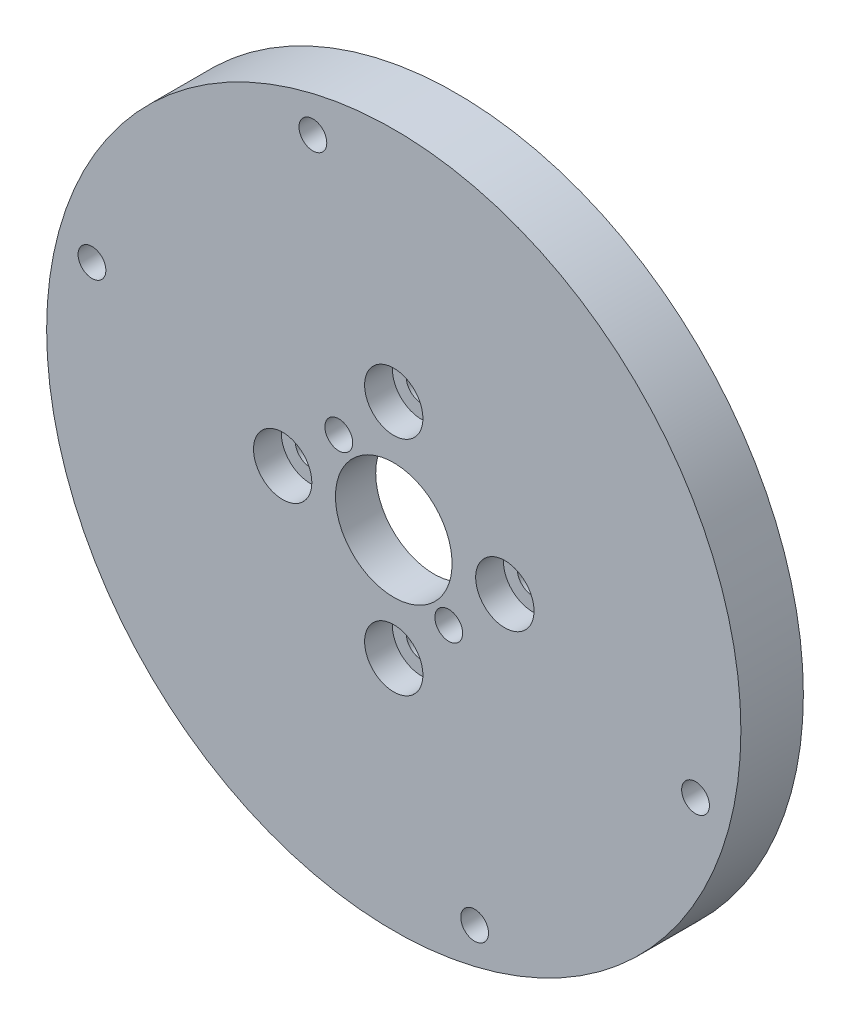
ISO-10303-21;
HEADER;
FILE_DESCRIPTION(('STEP AP214'),'2;1');
FILE_NAME('part.step','',(''),(''),'','','');
FILE_SCHEMA(('AUTOMOTIVE_DESIGN { 1 0 10303 214 1 1 1 1 }'));
ENDSEC;
DATA;
#1=APPLICATION_CONTEXT('core data for automotive mechanical design processes');
#2=APPLICATION_PROTOCOL_DEFINITION('international standard','automotive_design',2000,#1);
#3=PRODUCT_CONTEXT('',#1,'mechanical');
#4=PRODUCT('Part','Part','',(#3));
#5=PRODUCT_RELATED_PRODUCT_CATEGORY('part','',(#4));
#6=PRODUCT_DEFINITION_FORMATION('','',#4);
#7=PRODUCT_DEFINITION_CONTEXT('part definition',#1,'design');
#8=PRODUCT_DEFINITION('design','',#6,#7);
#9=PRODUCT_DEFINITION_SHAPE('','',#8);
#10=(LENGTH_UNIT() NAMED_UNIT(*) SI_UNIT(.MILLI.,.METRE.));
#11=(NAMED_UNIT(*) PLANE_ANGLE_UNIT() SI_UNIT($,.RADIAN.));
#12=(NAMED_UNIT(*) SI_UNIT($,.STERADIAN.) SOLID_ANGLE_UNIT());
#13=UNCERTAINTY_MEASURE_WITH_UNIT(LENGTH_MEASURE(1.E-05),#10,'distance_accuracy_value','');
#14=(GEOMETRIC_REPRESENTATION_CONTEXT(3) GLOBAL_UNCERTAINTY_ASSIGNED_CONTEXT((#13)) GLOBAL_UNIT_ASSIGNED_CONTEXT((#10,
#11,#12)) REPRESENTATION_CONTEXT('',''));
#15=CARTESIAN_POINT('',(0.,0.,0.));
#16=DIRECTION('',(0.,0.,1.));
#17=DIRECTION('',(1.,0.,0.));
#18=AXIS2_PLACEMENT_3D('',#15,#16,#17);
#19=CARTESIAN_POINT('',(8.00000000000027,2.75810479722345E-13,4.5));
#20=DIRECTION('',(0.,0.,-1.));
#21=DIRECTION('',(-1.,0.,0.));
#22=AXIS2_PLACEMENT_3D('',#19,#20,#21);
#23=CYLINDRICAL_SURFACE('',#22,1.10000000000009);
#24=CARTESIAN_POINT('',(8.00000000000027,2.75810479722345E-13,2.5));
#25=DIRECTION('',(0.,0.,1.));
#26=DIRECTION('',(1.,0.,0.));
#27=AXIS2_PLACEMENT_3D('',#24,#25,#26);
#28=CIRCLE('',#27,1.10000000000009);
#29=CARTESIAN_POINT('',(9.10000000000036,2.75810479722345E-13,2.5));
#30=VERTEX_POINT('',#29);
#31=EDGE_CURVE('E37',#30,#30,#28,.T.);
#32=ORIENTED_EDGE('',*,*,#31,.T.);
#33=EDGE_LOOP('',(#32));
#34=FACE_BOUND('',#33,.T.);
#35=CARTESIAN_POINT('',(8.00000000000027,2.75810479722345E-13,1.6));
#36=DIRECTION('',(0.,0.,-1.));
#37=DIRECTION('',(-1.,0.,0.));
#38=AXIS2_PLACEMENT_3D('',#35,#36,#37);
#39=CIRCLE('',#38,1.10000000000009);
#40=CARTESIAN_POINT('',(6.90000000000019,2.75810479722345E-13,1.6));
#41=VERTEX_POINT('',#40);
#42=EDGE_CURVE('E231',#41,#41,#39,.T.);
#43=ORIENTED_EDGE('',*,*,#42,.T.);
#44=EDGE_LOOP('',(#43));
#45=FACE_BOUND('',#44,.T.);
#46=ADVANCED_FACE('F33',(#34,#45),#23,.F.);
#47=CARTESIAN_POINT('',(5.5162095944469E-13,-8.,4.5));
#48=DIRECTION('',(0.,0.,-1.));
#49=DIRECTION('',(-1.,0.,0.));
#50=AXIS2_PLACEMENT_3D('',#47,#48,#49);
#51=CYLINDRICAL_SURFACE('',#50,1.10000000000014);
#52=CARTESIAN_POINT('',(5.5162095944469E-13,-8.,2.5));
#53=DIRECTION('',(0.,0.,1.));
#54=DIRECTION('',(1.,0.,0.));
#55=AXIS2_PLACEMENT_3D('',#52,#53,#54);
#56=CIRCLE('',#55,1.10000000000014);
#57=CARTESIAN_POINT('',(1.10000000000069,-8.,2.5));
#58=VERTEX_POINT('',#57);
#59=EDGE_CURVE('E59',#58,#58,#56,.T.);
#60=ORIENTED_EDGE('',*,*,#59,.T.);
#61=EDGE_LOOP('',(#60));
#62=FACE_BOUND('',#61,.T.);
#63=CARTESIAN_POINT('',(5.5162095944469E-13,-8.,1.6));
#64=DIRECTION('',(0.,0.,-1.));
#65=DIRECTION('',(-1.,0.,0.));
#66=AXIS2_PLACEMENT_3D('',#63,#64,#65);
#67=CIRCLE('',#66,1.10000000000014);
#68=CARTESIAN_POINT('',(-1.09999999999958,-8.,1.6));
#69=VERTEX_POINT('',#68);
#70=EDGE_CURVE('E228',#69,#69,#67,.T.);
#71=ORIENTED_EDGE('',*,*,#70,.T.);
#72=EDGE_LOOP('',(#71));
#73=FACE_BOUND('',#72,.T.);
#74=ADVANCED_FACE('F116',(#62,#73),#51,.F.);
#75=CARTESIAN_POINT('',(-7.99999999999972,-2.76790197161663E-13,4.5));
#76=DIRECTION('',(0.,0.,-1.));
#77=DIRECTION('',(-1.,0.,0.));
#78=AXIS2_PLACEMENT_3D('',#75,#76,#77);
#79=CYLINDRICAL_SURFACE('',#78,1.10000000000022);
#80=CARTESIAN_POINT('',(-7.99999999999972,-2.76790197161663E-13,2.5));
#81=DIRECTION('',(0.,0.,1.));
#82=DIRECTION('',(1.,0.,0.));
#83=AXIS2_PLACEMENT_3D('',#80,#81,#82);
#84=CIRCLE('',#83,1.10000000000022);
#85=CARTESIAN_POINT('',(-6.89999999999951,-2.76790197161663E-13,2.5));
#86=VERTEX_POINT('',#85);
#87=EDGE_CURVE('E57',#86,#86,#84,.T.);
#88=ORIENTED_EDGE('',*,*,#87,.T.);
#89=EDGE_LOOP('',(#88));
#90=FACE_BOUND('',#89,.T.);
#91=CARTESIAN_POINT('',(-7.99999999999972,-2.76790197161663E-13,1.6));
#92=DIRECTION('',(0.,0.,-1.));
#93=DIRECTION('',(-1.,0.,0.));
#94=AXIS2_PLACEMENT_3D('',#91,#92,#93);
#95=CIRCLE('',#94,1.10000000000022);
#96=CARTESIAN_POINT('',(-9.09999999999994,-2.76790197161663E-13,1.6));
#97=VERTEX_POINT('',#96);
#98=EDGE_CURVE('E225',#97,#97,#95,.T.);
#99=ORIENTED_EDGE('',*,*,#98,.T.);
#100=EDGE_LOOP('',(#99));
#101=FACE_BOUND('',#100,.T.);
#102=ADVANCED_FACE('F120',(#90,#101),#79,.F.);
#103=CARTESIAN_POINT('',(0.,8.,4.5));
#104=DIRECTION('',(0.,0.,-1.));
#105=DIRECTION('',(-1.,0.,0.));
#106=AXIS2_PLACEMENT_3D('',#103,#104,#105);
#107=CYLINDRICAL_SURFACE('',#106,1.1);
#108=CARTESIAN_POINT('',(0.,8.,2.5));
#109=DIRECTION('',(0.,0.,1.));
#110=DIRECTION('',(1.,0.,0.));
#111=AXIS2_PLACEMENT_3D('',#108,#109,#110);
#112=CIRCLE('',#111,1.1);
#113=CARTESIAN_POINT('',(1.1,8.,2.5));
#114=VERTEX_POINT('',#113);
#115=EDGE_CURVE('E52',#114,#114,#112,.T.);
#116=ORIENTED_EDGE('',*,*,#115,.T.);
#117=EDGE_LOOP('',(#116));
#118=FACE_BOUND('',#117,.T.);
#119=CARTESIAN_POINT('',(0.,8.,1.6));
#120=DIRECTION('',(0.,0.,-1.));
#121=DIRECTION('',(-1.,0.,0.));
#122=AXIS2_PLACEMENT_3D('',#119,#120,#121);
#123=CIRCLE('',#122,1.1);
#124=CARTESIAN_POINT('',(-1.1,8.,1.6));
#125=VERTEX_POINT('',#124);
#126=EDGE_CURVE('E220',#125,#125,#123,.T.);
#127=ORIENTED_EDGE('',*,*,#126,.T.);
#128=EDGE_LOOP('',(#127));
#129=FACE_BOUND('',#128,.T.);
#130=ADVANCED_FACE('F125',(#118,#129),#107,.F.);
#131=CARTESIAN_POINT('',(0.,0.,4.5));
#132=DIRECTION('',(0.,0.,1.));
#133=DIRECTION('',(1.,0.,0.));
#134=AXIS2_PLACEMENT_3D('',#131,#132,#133);
#135=PLANE('',#134);
#136=CARTESIAN_POINT('',(3.95979797464466,-3.95979797464467,4.5));
#137=DIRECTION('',(0.,0.,1.));
#138=DIRECTION('',(1.,0.,0.));
#139=AXIS2_PLACEMENT_3D('',#136,#137,#138);
#140=CIRCLE('',#139,0.999999999999998);
#141=CARTESIAN_POINT('',(4.95979797464466,-3.95979797464467,4.5));
#142=VERTEX_POINT('',#141);
#143=EDGE_CURVE('E200',#142,#142,#140,.T.);
#144=ORIENTED_EDGE('',*,*,#143,.F.);
#145=EDGE_LOOP('',(#144));
#146=FACE_BOUND('',#145,.T.);
#147=CARTESIAN_POINT('',(-3.95979797464466,3.95979797464467,4.5));
#148=DIRECTION('',(0.,0.,1.));
#149=DIRECTION('',(1.,0.,0.));
#150=AXIS2_PLACEMENT_3D('',#147,#148,#149);
#151=CIRCLE('',#150,1.);
#152=CARTESIAN_POINT('',(-2.95979797464466,3.95979797464467,4.5));
#153=VERTEX_POINT('',#152);
#154=EDGE_CURVE('E199',#153,#153,#151,.T.);
#155=ORIENTED_EDGE('',*,*,#154,.F.);
#156=EDGE_LOOP('',(#155));
#157=FACE_BOUND('',#156,.T.);
#158=CARTESIAN_POINT('',(0.,0.,4.5));
#159=DIRECTION('',(0.,0.,-1.));
#160=DIRECTION('',(-1.,0.,0.));
#161=AXIS2_PLACEMENT_3D('',#158,#159,#160);
#162=CIRCLE('',#161,4.2);
#163=CARTESIAN_POINT('',(-4.2,0.,4.5));
#164=VERTEX_POINT('',#163);
#165=EDGE_CURVE('E211',#164,#164,#162,.T.);
#166=ORIENTED_EDGE('',*,*,#165,.T.);
#167=EDGE_LOOP('',(#166));
#168=FACE_BOUND('',#167,.T.);
#169=CARTESIAN_POINT('',(8.00000000000023,2.26393958003914E-13,4.5));
#170=DIRECTION('',(0.,0.,1.));
#171=DIRECTION('',(1.,0.,0.));
#172=AXIS2_PLACEMENT_3D('',#169,#170,#171);
#173=CIRCLE('',#172,2.10000000000018);
#174=CARTESIAN_POINT('',(10.1000000000004,2.26393958003914E-13,4.5));
#175=VERTEX_POINT('',#174);
#176=EDGE_CURVE('E237',#175,#175,#173,.T.);
#177=ORIENTED_EDGE('',*,*,#176,.F.);
#178=EDGE_LOOP('',(#177));
#179=FACE_BOUND('',#178,.T.);
#180=CARTESIAN_POINT('',(4.52787916007828E-13,-8.,4.5));
#181=DIRECTION('',(0.,0.,1.));
#182=DIRECTION('',(1.,0.,0.));
#183=AXIS2_PLACEMENT_3D('',#180,#181,#182);
#184=CIRCLE('',#183,2.10000000000049);
#185=CARTESIAN_POINT('',(2.10000000000094,-8.,4.5));
#186=VERTEX_POINT('',#185);
#187=EDGE_CURVE('E243',#186,#186,#184,.T.);
#188=ORIENTED_EDGE('',*,*,#187,.F.);
#189=EDGE_LOOP('',(#188));
#190=FACE_BOUND('',#189,.T.);
#191=CARTESIAN_POINT('',(-7.99999999999977,-2.27373675443232E-13,4.5));
#192=DIRECTION('',(0.,0.,1.));
#193=DIRECTION('',(1.,0.,0.));
#194=AXIS2_PLACEMENT_3D('',#191,#192,#193);
#195=CIRCLE('',#194,2.10000000000036);
#196=CARTESIAN_POINT('',(-5.89999999999941,-2.27373675443232E-13,4.5));
#197=VERTEX_POINT('',#196);
#198=EDGE_CURVE('E234',#197,#197,#195,.T.);
#199=ORIENTED_EDGE('',*,*,#198,.F.);
#200=EDGE_LOOP('',(#199));
#201=FACE_BOUND('',#200,.T.);
#202=CARTESIAN_POINT('',(0.,8.,4.5));
#203=DIRECTION('',(0.,0.,1.));
#204=DIRECTION('',(1.,0.,0.));
#205=AXIS2_PLACEMENT_3D('',#202,#203,#204);
#206=CIRCLE('',#205,2.1);
#207=CARTESIAN_POINT('',(2.1,8.,4.5));
#208=VERTEX_POINT('',#207);
#209=EDGE_CURVE('E65',#208,#208,#206,.T.);
#210=ORIENTED_EDGE('',*,*,#209,.F.);
#211=EDGE_LOOP('',(#210));
#212=FACE_BOUND('',#211,.T.);
#213=CARTESIAN_POINT('',(5.82342851480674,-21.733331091504,4.5));
#214=DIRECTION('',(0.,0.,1.));
#215=DIRECTION('',(1.,0.,0.));
#216=AXIS2_PLACEMENT_3D('',#213,#214,#215);
#217=CIRCLE('',#216,0.999999999999999);
#218=CARTESIAN_POINT('',(6.82342851480674,-21.733331091504,4.5));
#219=VERTEX_POINT('',#218);
#220=EDGE_CURVE('E82',#219,#219,#217,.T.);
#221=ORIENTED_EDGE('',*,*,#220,.F.);
#222=EDGE_LOOP('',(#221));
#223=FACE_BOUND('',#222,.T.);
#224=CARTESIAN_POINT('',(0.,0.,4.5));
#225=DIRECTION('',(0.,0.,1.));
#226=DIRECTION('',(1.,0.,0.));
#227=AXIS2_PLACEMENT_3D('',#224,#225,#226);
#228=CIRCLE('',#227,25.);
#229=CARTESIAN_POINT('',(25.,0.,4.5));
#230=VERTEX_POINT('',#229);
#231=EDGE_CURVE('E10',#230,#230,#228,.T.);
#232=ORIENTED_EDGE('',*,*,#231,.T.);
#233=EDGE_LOOP('',(#232));
#234=FACE_BOUND('',#233,.T.);
#235=CARTESIAN_POINT('',(-5.82342851480674,21.733331091504,4.5));
#236=DIRECTION('',(0.,0.,1.));
#237=DIRECTION('',(1.,0.,0.));
#238=AXIS2_PLACEMENT_3D('',#235,#236,#237);
#239=CIRCLE('',#238,1.);
#240=CARTESIAN_POINT('',(-4.82342851480674,21.733331091504,4.5));
#241=VERTEX_POINT('',#240);
#242=EDGE_CURVE('E46',#241,#241,#239,.T.);
#243=ORIENTED_EDGE('',*,*,#242,.F.);
#244=EDGE_LOOP('',(#243));
#245=FACE_BOUND('',#244,.T.);
#246=CARTESIAN_POINT('',(21.733331091504,-5.82342851480681,4.5));
#247=DIRECTION('',(0.,0.,1.));
#248=DIRECTION('',(-1.,0.,0.));
#249=AXIS2_PLACEMENT_3D('',#246,#247,#248);
#250=CIRCLE('',#249,1.);
#251=CARTESIAN_POINT('',(20.733331091504,-5.82342851480681,4.5));
#252=VERTEX_POINT('',#251);
#253=EDGE_CURVE('E88',#252,#252,#250,.T.);
#254=ORIENTED_EDGE('',*,*,#253,.F.);
#255=EDGE_LOOP('',(#254));
#256=FACE_BOUND('',#255,.T.);
#257=CARTESIAN_POINT('',(-21.733331091504,5.82342851480681,4.5));
#258=DIRECTION('',(0.,0.,1.));
#259=DIRECTION('',(-1.,0.,0.));
#260=AXIS2_PLACEMENT_3D('',#257,#258,#259);
#261=CIRCLE('',#260,0.999999999999998);
#262=CARTESIAN_POINT('',(-22.733331091504,5.82342851480681,4.5));
#263=VERTEX_POINT('',#262);
#264=EDGE_CURVE('E76',#263,#263,#261,.T.);
#265=ORIENTED_EDGE('',*,*,#264,.F.);
#266=EDGE_LOOP('',(#265));
#267=FACE_BOUND('',#266,.T.);
#268=ADVANCED_FACE('F252',(#146,#157,#168,#179,#190,#201,#212,#223,#234,#245,#256,#267),#135,.T.);
#269=CARTESIAN_POINT('',(0.,0.,0.));
#270=DIRECTION('',(0.,0.,1.));
#271=DIRECTION('',(1.,0.,0.));
#272=AXIS2_PLACEMENT_3D('',#269,#270,#271);
#273=PLANE('',#272);
#274=CARTESIAN_POINT('',(0.,0.,0.));
#275=DIRECTION('',(0.,0.,-1.));
#276=DIRECTION('',(-1.,0.,0.));
#277=AXIS2_PLACEMENT_3D('',#274,#275,#276);
#278=CIRCLE('',#277,10.);
#279=CARTESIAN_POINT('',(-10.,0.,0.));
#280=VERTEX_POINT('',#279);
#281=EDGE_CURVE('E214',#280,#280,#278,.T.);
#282=ORIENTED_EDGE('',*,*,#281,.F.);
#283=EDGE_LOOP('',(#282));
#284=FACE_BOUND('',#283,.T.);
#285=CARTESIAN_POINT('',(0.,0.,0.));
#286=DIRECTION('',(0.,0.,1.));
#287=DIRECTION('',(1.,0.,0.));
#288=AXIS2_PLACEMENT_3D('',#285,#286,#287);
#289=CIRCLE('',#288,25.);
#290=CARTESIAN_POINT('',(25.,0.,0.));
#291=VERTEX_POINT('',#290);
#292=EDGE_CURVE('E41',#291,#291,#289,.T.);
#293=ORIENTED_EDGE('',*,*,#292,.F.);
#294=EDGE_LOOP('',(#293));
#295=FACE_BOUND('',#294,.T.);
#296=CARTESIAN_POINT('',(-5.82342851480674,21.733331091504,0.));
#297=DIRECTION('',(0.,0.,1.));
#298=DIRECTION('',(1.,0.,0.));
#299=AXIS2_PLACEMENT_3D('',#296,#297,#298);
#300=CIRCLE('',#299,1.);
#301=CARTESIAN_POINT('',(-4.82342851480674,21.733331091504,0.));
#302=VERTEX_POINT('',#301);
#303=EDGE_CURVE('E49',#302,#302,#300,.T.);
#304=ORIENTED_EDGE('',*,*,#303,.T.);
#305=EDGE_LOOP('',(#304));
#306=FACE_BOUND('',#305,.T.);
#307=CARTESIAN_POINT('',(21.733331091504,-5.82342851480681,0.));
#308=DIRECTION('',(0.,0.,1.));
#309=DIRECTION('',(-1.,0.,0.));
#310=AXIS2_PLACEMENT_3D('',#307,#308,#309);
#311=CIRCLE('',#310,1.);
#312=CARTESIAN_POINT('',(20.733331091504,-5.82342851480681,0.));
#313=VERTEX_POINT('',#312);
#314=EDGE_CURVE('E85',#313,#313,#311,.T.);
#315=ORIENTED_EDGE('',*,*,#314,.T.);
#316=EDGE_LOOP('',(#315));
#317=FACE_BOUND('',#316,.T.);
#318=CARTESIAN_POINT('',(5.82342851480674,-21.733331091504,0.));
#319=DIRECTION('',(0.,0.,1.));
#320=DIRECTION('',(1.,0.,0.));
#321=AXIS2_PLACEMENT_3D('',#318,#319,#320);
#322=CIRCLE('',#321,0.999999999999999);
#323=CARTESIAN_POINT('',(6.82342851480674,-21.733331091504,0.));
#324=VERTEX_POINT('',#323);
#325=EDGE_CURVE('E79',#324,#324,#322,.T.);
#326=ORIENTED_EDGE('',*,*,#325,.T.);
#327=EDGE_LOOP('',(#326));
#328=FACE_BOUND('',#327,.T.);
#329=CARTESIAN_POINT('',(-21.733331091504,5.82342851480681,0.));
#330=DIRECTION('',(0.,0.,1.));
#331=DIRECTION('',(-1.,0.,0.));
#332=AXIS2_PLACEMENT_3D('',#329,#330,#331);
#333=CIRCLE('',#332,0.999999999999998);
#334=CARTESIAN_POINT('',(-22.733331091504,5.82342851480681,0.));
#335=VERTEX_POINT('',#334);
#336=EDGE_CURVE('E55',#335,#335,#333,.T.);
#337=ORIENTED_EDGE('',*,*,#336,.T.);
#338=EDGE_LOOP('',(#337));
#339=FACE_BOUND('',#338,.T.);
#340=ADVANCED_FACE('F98',(#284,#295,#306,#317,#328,#339),#273,.F.);
#341=CARTESIAN_POINT('',(0.,0.,4.5));
#342=DIRECTION('',(0.,0.,-1.));
#343=DIRECTION('',(-1.,0.,0.));
#344=AXIS2_PLACEMENT_3D('',#341,#342,#343);
#345=CYLINDRICAL_SURFACE('',#344,25.);
#346=ORIENTED_EDGE('',*,*,#231,.F.);
#347=EDGE_LOOP('',(#346));
#348=FACE_BOUND('',#347,.T.);
#349=ORIENTED_EDGE('',*,*,#292,.T.);
#350=EDGE_LOOP('',(#349));
#351=FACE_BOUND('',#350,.T.);
#352=ADVANCED_FACE('F35',(#348,#351),#345,.T.);
#353=CARTESIAN_POINT('',(-5.82342851480674,21.733331091504,4.5));
#354=DIRECTION('',(0.,0.,-1.));
#355=DIRECTION('',(-1.,0.,0.));
#356=AXIS2_PLACEMENT_3D('',#353,#354,#355);
#357=CYLINDRICAL_SURFACE('',#356,1.);
#358=ORIENTED_EDGE('',*,*,#242,.T.);
#359=EDGE_LOOP('',(#358));
#360=FACE_BOUND('',#359,.T.);
#361=ORIENTED_EDGE('',*,*,#303,.F.);
#362=EDGE_LOOP('',(#361));
#363=FACE_BOUND('',#362,.T.);
#364=ADVANCED_FACE('F101',(#360,#363),#357,.F.);
#365=CARTESIAN_POINT('',(21.733331091504,-5.82342851480681,4.5));
#366=DIRECTION('',(0.,0.,-1.));
#367=DIRECTION('',(-1.,0.,0.));
#368=AXIS2_PLACEMENT_3D('',#365,#366,#367);
#369=CYLINDRICAL_SURFACE('',#368,1.);
#370=ORIENTED_EDGE('',*,*,#253,.T.);
#371=EDGE_LOOP('',(#370));
#372=FACE_BOUND('',#371,.T.);
#373=ORIENTED_EDGE('',*,*,#314,.F.);
#374=EDGE_LOOP('',(#373));
#375=FACE_BOUND('',#374,.T.);
#376=ADVANCED_FACE('F103',(#372,#375),#369,.F.);
#377=CARTESIAN_POINT('',(5.82342851480674,-21.733331091504,4.5));
#378=DIRECTION('',(0.,0.,-1.));
#379=DIRECTION('',(-1.,0.,0.));
#380=AXIS2_PLACEMENT_3D('',#377,#378,#379);
#381=CYLINDRICAL_SURFACE('',#380,0.999999999999999);
#382=ORIENTED_EDGE('',*,*,#220,.T.);
#383=EDGE_LOOP('',(#382));
#384=FACE_BOUND('',#383,.T.);
#385=ORIENTED_EDGE('',*,*,#325,.F.);
#386=EDGE_LOOP('',(#385));
#387=FACE_BOUND('',#386,.T.);
#388=ADVANCED_FACE('F109',(#384,#387),#381,.F.);
#389=CARTESIAN_POINT('',(-21.733331091504,5.82342851480681,4.5));
#390=DIRECTION('',(0.,0.,-1.));
#391=DIRECTION('',(-1.,0.,0.));
#392=AXIS2_PLACEMENT_3D('',#389,#390,#391);
#393=CYLINDRICAL_SURFACE('',#392,0.999999999999998);
#394=ORIENTED_EDGE('',*,*,#264,.T.);
#395=EDGE_LOOP('',(#394));
#396=FACE_BOUND('',#395,.T.);
#397=ORIENTED_EDGE('',*,*,#336,.F.);
#398=EDGE_LOOP('',(#397));
#399=FACE_BOUND('',#398,.T.);
#400=ADVANCED_FACE('F130',(#396,#399),#393,.F.);
#401=CARTESIAN_POINT('',(0.,8.,2.5));
#402=DIRECTION('',(0.,0.,1.));
#403=DIRECTION('',(1.,0.,0.));
#404=AXIS2_PLACEMENT_3D('',#401,#402,#403);
#405=CYLINDRICAL_SURFACE('',#404,2.1);
#406=CARTESIAN_POINT('',(0.,8.,2.5));
#407=DIRECTION('',(0.,0.,1.));
#408=DIRECTION('',(1.,0.,0.));
#409=AXIS2_PLACEMENT_3D('',#406,#407,#408);
#410=CIRCLE('',#409,2.1);
#411=CARTESIAN_POINT('',(2.1,8.,2.5));
#412=VERTEX_POINT('',#411);
#413=EDGE_CURVE('E56',#412,#412,#410,.T.);
#414=ORIENTED_EDGE('',*,*,#413,.F.);
#415=EDGE_LOOP('',(#414));
#416=FACE_BOUND('',#415,.T.);
#417=ORIENTED_EDGE('',*,*,#209,.T.);
#418=EDGE_LOOP('',(#417));
#419=FACE_BOUND('',#418,.T.);
#420=ADVANCED_FACE('F134',(#416,#419),#405,.F.);
#421=CARTESIAN_POINT('',(0.,8.,2.5));
#422=DIRECTION('',(0.,0.,1.));
#423=DIRECTION('',(1.,0.,0.));
#424=AXIS2_PLACEMENT_3D('',#421,#422,#423);
#425=PLANE('',#424);
#426=ORIENTED_EDGE('',*,*,#115,.F.);
#427=EDGE_LOOP('',(#426));
#428=FACE_BOUND('',#427,.T.);
#429=ORIENTED_EDGE('',*,*,#413,.T.);
#430=EDGE_LOOP('',(#429));
#431=FACE_BOUND('',#430,.T.);
#432=ADVANCED_FACE('F138',(#428,#431),#425,.T.);
#433=CARTESIAN_POINT('',(-7.99999999999977,-2.27373675443232E-13,2.5));
#434=DIRECTION('',(0.,0.,1.));
#435=DIRECTION('',(1.,0.,0.));
#436=AXIS2_PLACEMENT_3D('',#433,#434,#435);
#437=CYLINDRICAL_SURFACE('',#436,2.10000000000036);
#438=CARTESIAN_POINT('',(-7.99999999999977,-2.27373675443232E-13,2.5));
#439=DIRECTION('',(0.,0.,1.));
#440=DIRECTION('',(1.,0.,0.));
#441=AXIS2_PLACEMENT_3D('',#438,#439,#440);
#442=CIRCLE('',#441,2.10000000000036);
#443=CARTESIAN_POINT('',(-5.89999999999941,-2.27373675443232E-13,2.5));
#444=VERTEX_POINT('',#443);
#445=EDGE_CURVE('E246',#444,#444,#442,.T.);
#446=ORIENTED_EDGE('',*,*,#445,.F.);
#447=EDGE_LOOP('',(#446));
#448=FACE_BOUND('',#447,.T.);
#449=ORIENTED_EDGE('',*,*,#198,.T.);
#450=EDGE_LOOP('',(#449));
#451=FACE_BOUND('',#450,.T.);
#452=ADVANCED_FACE('F142',(#448,#451),#437,.F.);
#453=CARTESIAN_POINT('',(-7.99999999999977,-2.27373675443232E-13,2.5));
#454=DIRECTION('',(0.,0.,1.));
#455=DIRECTION('',(1.,0.,0.));
#456=AXIS2_PLACEMENT_3D('',#453,#454,#455);
#457=PLANE('',#456);
#458=ORIENTED_EDGE('',*,*,#87,.F.);
#459=EDGE_LOOP('',(#458));
#460=FACE_BOUND('',#459,.T.);
#461=ORIENTED_EDGE('',*,*,#445,.T.);
#462=EDGE_LOOP('',(#461));
#463=FACE_BOUND('',#462,.T.);
#464=ADVANCED_FACE('F146',(#460,#463),#457,.T.);
#465=CARTESIAN_POINT('',(4.52787916007828E-13,-8.,2.5));
#466=DIRECTION('',(0.,0.,1.));
#467=DIRECTION('',(1.,0.,0.));
#468=AXIS2_PLACEMENT_3D('',#465,#466,#467);
#469=CYLINDRICAL_SURFACE('',#468,2.10000000000049);
#470=CARTESIAN_POINT('',(4.52787916007828E-13,-8.,2.5));
#471=DIRECTION('',(0.,0.,1.));
#472=DIRECTION('',(1.,0.,0.));
#473=AXIS2_PLACEMENT_3D('',#470,#471,#472);
#474=CIRCLE('',#473,2.10000000000049);
#475=CARTESIAN_POINT('',(2.10000000000094,-8.,2.5));
#476=VERTEX_POINT('',#475);
#477=EDGE_CURVE('E240',#476,#476,#474,.T.);
#478=ORIENTED_EDGE('',*,*,#477,.F.);
#479=EDGE_LOOP('',(#478));
#480=FACE_BOUND('',#479,.T.);
#481=ORIENTED_EDGE('',*,*,#187,.T.);
#482=EDGE_LOOP('',(#481));
#483=FACE_BOUND('',#482,.T.);
#484=ADVANCED_FACE('F150',(#480,#483),#469,.F.);
#485=CARTESIAN_POINT('',(4.52787916007828E-13,-8.,2.5));
#486=DIRECTION('',(0.,0.,1.));
#487=DIRECTION('',(1.,0.,0.));
#488=AXIS2_PLACEMENT_3D('',#485,#486,#487);
#489=PLANE('',#488);
#490=ORIENTED_EDGE('',*,*,#59,.F.);
#491=EDGE_LOOP('',(#490));
#492=FACE_BOUND('',#491,.T.);
#493=ORIENTED_EDGE('',*,*,#477,.T.);
#494=EDGE_LOOP('',(#493));
#495=FACE_BOUND('',#494,.T.);
#496=ADVANCED_FACE('F154',(#492,#495),#489,.T.);
#497=CARTESIAN_POINT('',(8.00000000000023,2.26393958003914E-13,2.5));
#498=DIRECTION('',(0.,0.,1.));
#499=DIRECTION('',(1.,0.,0.));
#500=AXIS2_PLACEMENT_3D('',#497,#498,#499);
#501=CYLINDRICAL_SURFACE('',#500,2.10000000000018);
#502=CARTESIAN_POINT('',(8.00000000000023,2.26393958003914E-13,2.5));
#503=DIRECTION('',(0.,0.,1.));
#504=DIRECTION('',(1.,0.,0.));
#505=AXIS2_PLACEMENT_3D('',#502,#503,#504);
#506=CIRCLE('',#505,2.10000000000018);
#507=CARTESIAN_POINT('',(10.1000000000004,2.26393958003914E-13,2.5));
#508=VERTEX_POINT('',#507);
#509=EDGE_CURVE('E60',#508,#508,#506,.T.);
#510=ORIENTED_EDGE('',*,*,#509,.F.);
#511=EDGE_LOOP('',(#510));
#512=FACE_BOUND('',#511,.T.);
#513=ORIENTED_EDGE('',*,*,#176,.T.);
#514=EDGE_LOOP('',(#513));
#515=FACE_BOUND('',#514,.T.);
#516=ADVANCED_FACE('F158',(#512,#515),#501,.F.);
#517=CARTESIAN_POINT('',(8.00000000000023,2.26393958003914E-13,2.5));
#518=DIRECTION('',(0.,0.,1.));
#519=DIRECTION('',(1.,0.,0.));
#520=AXIS2_PLACEMENT_3D('',#517,#518,#519);
#521=PLANE('',#520);
#522=ORIENTED_EDGE('',*,*,#31,.F.);
#523=EDGE_LOOP('',(#522));
#524=FACE_BOUND('',#523,.T.);
#525=ORIENTED_EDGE('',*,*,#509,.T.);
#526=EDGE_LOOP('',(#525));
#527=FACE_BOUND('',#526,.T.);
#528=ADVANCED_FACE('F162',(#524,#527),#521,.T.);
#529=CARTESIAN_POINT('',(0.,0.,1.6));
#530=DIRECTION('',(0.,0.,-1.));
#531=DIRECTION('',(-1.,0.,0.));
#532=AXIS2_PLACEMENT_3D('',#529,#530,#531);
#533=CYLINDRICAL_SURFACE('',#532,10.);
#534=CARTESIAN_POINT('',(0.,0.,1.6));
#535=DIRECTION('',(0.,0.,-1.));
#536=DIRECTION('',(-1.,0.,0.));
#537=AXIS2_PLACEMENT_3D('',#534,#535,#536);
#538=CIRCLE('',#537,10.);
#539=CARTESIAN_POINT('',(-10.,0.,1.6));
#540=VERTEX_POINT('',#539);
#541=EDGE_CURVE('E217',#540,#540,#538,.T.);
#542=ORIENTED_EDGE('',*,*,#541,.F.);
#543=EDGE_LOOP('',(#542));
#544=FACE_BOUND('',#543,.T.);
#545=ORIENTED_EDGE('',*,*,#281,.T.);
#546=EDGE_LOOP('',(#545));
#547=FACE_BOUND('',#546,.T.);
#548=ADVANCED_FACE('F166',(#544,#547),#533,.F.);
#549=CARTESIAN_POINT('',(0.,0.,1.6));
#550=DIRECTION('',(0.,0.,-1.));
#551=DIRECTION('',(-1.,0.,0.));
#552=AXIS2_PLACEMENT_3D('',#549,#550,#551);
#553=PLANE('',#552);
#554=CARTESIAN_POINT('',(0.,0.,1.6));
#555=DIRECTION('',(0.,0.,-1.));
#556=DIRECTION('',(-1.,0.,0.));
#557=AXIS2_PLACEMENT_3D('',#554,#555,#556);
#558=CIRCLE('',#557,4.2);
#559=CARTESIAN_POINT('',(-4.2,0.,1.6));
#560=VERTEX_POINT('',#559);
#561=EDGE_CURVE('E209',#560,#560,#558,.T.);
#562=ORIENTED_EDGE('',*,*,#561,.F.);
#563=EDGE_LOOP('',(#562));
#564=FACE_BOUND('',#563,.T.);
#565=ORIENTED_EDGE('',*,*,#42,.F.);
#566=EDGE_LOOP('',(#565));
#567=FACE_BOUND('',#566,.T.);
#568=ORIENTED_EDGE('',*,*,#70,.F.);
#569=EDGE_LOOP('',(#568));
#570=FACE_BOUND('',#569,.T.);
#571=ORIENTED_EDGE('',*,*,#98,.F.);
#572=EDGE_LOOP('',(#571));
#573=FACE_BOUND('',#572,.T.);
#574=ORIENTED_EDGE('',*,*,#126,.F.);
#575=EDGE_LOOP('',(#574));
#576=FACE_BOUND('',#575,.T.);
#577=ORIENTED_EDGE('',*,*,#541,.T.);
#578=EDGE_LOOP('',(#577));
#579=FACE_BOUND('',#578,.T.);
#580=ADVANCED_FACE('F170',(#564,#567,#570,#573,#576,#579),#553,.T.);
#581=CARTESIAN_POINT('',(0.,0.,4.5));
#582=DIRECTION('',(0.,0.,-1.));
#583=DIRECTION('',(-1.,0.,0.));
#584=AXIS2_PLACEMENT_3D('',#581,#582,#583);
#585=CYLINDRICAL_SURFACE('',#584,4.2);
#586=ORIENTED_EDGE('',*,*,#165,.F.);
#587=EDGE_LOOP('',(#586));
#588=FACE_BOUND('',#587,.T.);
#589=ORIENTED_EDGE('',*,*,#561,.T.);
#590=EDGE_LOOP('',(#589));
#591=FACE_BOUND('',#590,.T.);
#592=ADVANCED_FACE('F174',(#588,#591),#585,.F.);
#593=CARTESIAN_POINT('',(-3.95979797464466,3.95979797464467,2.5));
#594=DIRECTION('',(0.,0.,1.));
#595=DIRECTION('',(1.,0.,0.));
#596=AXIS2_PLACEMENT_3D('',#593,#594,#595);
#597=CYLINDRICAL_SURFACE('',#596,1.);
#598=CARTESIAN_POINT('',(-3.95979797464466,3.95979797464467,2.5));
#599=DIRECTION('',(0.,0.,1.));
#600=DIRECTION('',(1.,0.,0.));
#601=AXIS2_PLACEMENT_3D('',#598,#599,#600);
#602=CIRCLE('',#601,1.);
#603=CARTESIAN_POINT('',(-2.95979797464466,3.95979797464467,2.5));
#604=VERTEX_POINT('',#603);
#605=EDGE_CURVE('E203',#604,#604,#602,.T.);
#606=ORIENTED_EDGE('',*,*,#605,.F.);
#607=EDGE_LOOP('',(#606));
#608=FACE_BOUND('',#607,.T.);
#609=ORIENTED_EDGE('',*,*,#154,.T.);
#610=EDGE_LOOP('',(#609));
#611=FACE_BOUND('',#610,.T.);
#612=ADVANCED_FACE('F178',(#608,#611),#597,.F.);
#613=CARTESIAN_POINT('',(-3.95979797464466,3.95979797464467,2.5));
#614=DIRECTION('',(0.,0.,1.));
#615=DIRECTION('',(1.,0.,0.));
#616=AXIS2_PLACEMENT_3D('',#613,#614,#615);
#617=PLANE('',#616);
#618=ORIENTED_EDGE('',*,*,#605,.T.);
#619=EDGE_LOOP('',(#618));
#620=FACE_BOUND('',#619,.T.);
#621=ADVANCED_FACE('F182',(#620),#617,.T.);
#622=CARTESIAN_POINT('',(3.95979797464466,-3.95979797464467,2.5));
#623=DIRECTION('',(0.,0.,1.));
#624=DIRECTION('',(1.,0.,0.));
#625=AXIS2_PLACEMENT_3D('',#622,#623,#624);
#626=CYLINDRICAL_SURFACE('',#625,0.999999999999998);
#627=CARTESIAN_POINT('',(3.95979797464466,-3.95979797464467,2.5));
#628=DIRECTION('',(0.,0.,1.));
#629=DIRECTION('',(1.,0.,0.));
#630=AXIS2_PLACEMENT_3D('',#627,#628,#629);
#631=CIRCLE('',#630,0.999999999999998);
#632=CARTESIAN_POINT('',(4.95979797464466,-3.95979797464467,2.5));
#633=VERTEX_POINT('',#632);
#634=EDGE_CURVE('E198',#633,#633,#631,.T.);
#635=ORIENTED_EDGE('',*,*,#634,.F.);
#636=EDGE_LOOP('',(#635));
#637=FACE_BOUND('',#636,.T.);
#638=ORIENTED_EDGE('',*,*,#143,.T.);
#639=EDGE_LOOP('',(#638));
#640=FACE_BOUND('',#639,.T.);
#641=ADVANCED_FACE('F186',(#637,#640),#626,.F.);
#642=CARTESIAN_POINT('',(3.95979797464466,-3.95979797464467,2.5));
#643=DIRECTION('',(0.,0.,1.));
#644=DIRECTION('',(1.,0.,0.));
#645=AXIS2_PLACEMENT_3D('',#642,#643,#644);
#646=PLANE('',#645);
#647=ORIENTED_EDGE('',*,*,#634,.T.);
#648=EDGE_LOOP('',(#647));
#649=FACE_BOUND('',#648,.T.);
#650=ADVANCED_FACE('F190',(#649),#646,.T.);
#651=CLOSED_SHELL('',(#46,#74,#102,#130,#268,#340,#352,#364,#376,#388,#400,#420,#432,#452,#464,
#484,#496,#516,#528,#548,#580,#592,#612,#621,#641,#650));
#652=MANIFOLD_SOLID_BREP('B2',#651);
#653=ADVANCED_BREP_SHAPE_REPRESENTATION('',(#18,#652),#14);
#654=SHAPE_DEFINITION_REPRESENTATION(#9,#653);
ENDSEC;
END-ISO-10303-21;
